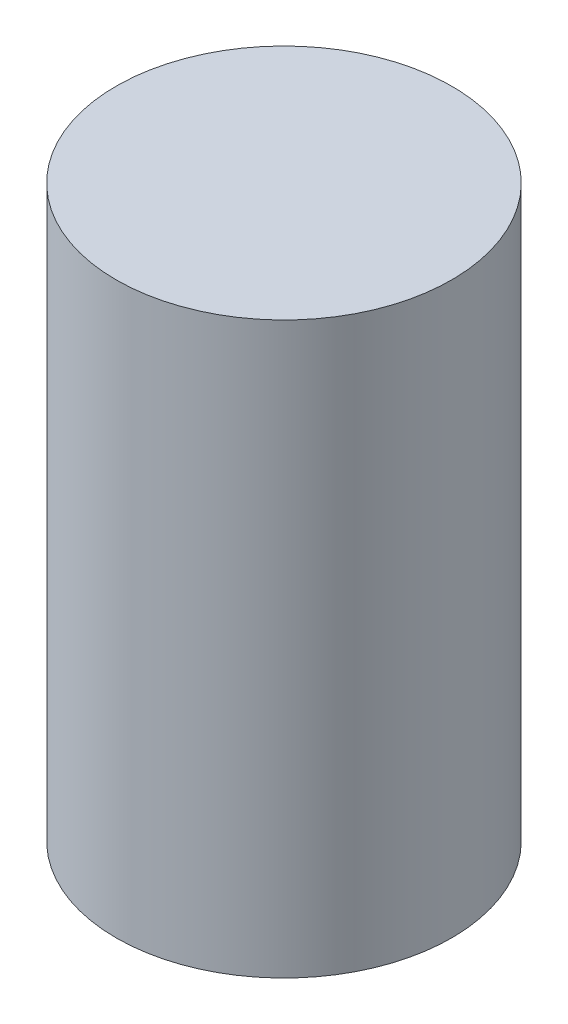
ISO-10303-21;
HEADER;
FILE_DESCRIPTION(('STEP AP214'),'2;1');
FILE_NAME('part.step','',(''),(''),'','','');
FILE_SCHEMA(('AUTOMOTIVE_DESIGN { 1 0 10303 214 1 1 1 1 }'));
ENDSEC;
DATA;
#1=APPLICATION_CONTEXT('core data for automotive mechanical design processes');
#2=APPLICATION_PROTOCOL_DEFINITION('international standard','automotive_design',2000,#1);
#3=PRODUCT_CONTEXT('',#1,'mechanical');
#4=PRODUCT('Part','Part','',(#3));
#5=PRODUCT_RELATED_PRODUCT_CATEGORY('part','',(#4));
#6=PRODUCT_DEFINITION_FORMATION('','',#4);
#7=PRODUCT_DEFINITION_CONTEXT('part definition',#1,'design');
#8=PRODUCT_DEFINITION('design','',#6,#7);
#9=PRODUCT_DEFINITION_SHAPE('','',#8);
#10=(LENGTH_UNIT() NAMED_UNIT(*) SI_UNIT(.MILLI.,.METRE.));
#11=(NAMED_UNIT(*) PLANE_ANGLE_UNIT() SI_UNIT($,.RADIAN.));
#12=(NAMED_UNIT(*) SI_UNIT($,.STERADIAN.) SOLID_ANGLE_UNIT());
#13=UNCERTAINTY_MEASURE_WITH_UNIT(LENGTH_MEASURE(1.E-05),#10,'distance_accuracy_value','');
#14=(GEOMETRIC_REPRESENTATION_CONTEXT(3) GLOBAL_UNCERTAINTY_ASSIGNED_CONTEXT((#13)) GLOBAL_UNIT_ASSIGNED_CONTEXT((#10,
#11,#12)) REPRESENTATION_CONTEXT('',''));
#15=CARTESIAN_POINT('',(0.,0.,0.));
#16=DIRECTION('',(0.,0.,1.));
#17=DIRECTION('',(1.,0.,0.));
#18=AXIS2_PLACEMENT_3D('',#15,#16,#17);
#19=CARTESIAN_POINT('',(0.,250.,0.));
#20=DIRECTION('',(0.,-1.,0.));
#21=DIRECTION('',(0.,0.,-1.));
#22=AXIS2_PLACEMENT_3D('',#19,#20,#21);
#23=CYLINDRICAL_SURFACE('',#22,73.61);
#24=CARTESIAN_POINT('',(0.,250.,0.));
#25=DIRECTION('',(0.,1.,0.));
#26=DIRECTION('',(0.,0.,1.));
#27=AXIS2_PLACEMENT_3D('',#24,#25,#26);
#28=CIRCLE('',#27,73.61);
#29=CARTESIAN_POINT('',(0.,250.,73.61));
#30=VERTEX_POINT('',#29);
#31=EDGE_CURVE('E10',#30,#30,#28,.T.);
#32=ORIENTED_EDGE('',*,*,#31,.F.);
#33=EDGE_LOOP('',(#32));
#34=FACE_BOUND('',#33,.T.);
#35=CARTESIAN_POINT('',(0.,0.,0.));
#36=DIRECTION('',(0.,1.,0.));
#37=DIRECTION('',(0.,0.,1.));
#38=AXIS2_PLACEMENT_3D('',#35,#36,#37);
#39=CIRCLE('',#38,73.61);
#40=CARTESIAN_POINT('',(0.,0.,73.61));
#41=VERTEX_POINT('',#40);
#42=EDGE_CURVE('E36',#41,#41,#39,.T.);
#43=ORIENTED_EDGE('',*,*,#42,.T.);
#44=EDGE_LOOP('',(#43));
#45=FACE_BOUND('',#44,.T.);
#46=ADVANCED_FACE('F33',(#34,#45),#23,.T.);
#47=CARTESIAN_POINT('',(0.,250.,0.));
#48=DIRECTION('',(0.,1.,0.));
#49=DIRECTION('',(0.,0.,1.));
#50=AXIS2_PLACEMENT_3D('',#47,#48,#49);
#51=PLANE('',#50);
#52=ORIENTED_EDGE('',*,*,#31,.T.);
#53=EDGE_LOOP('',(#52));
#54=FACE_BOUND('',#53,.T.);
#55=ADVANCED_FACE('F48',(#54),#51,.T.);
#56=CARTESIAN_POINT('',(0.,0.,0.));
#57=DIRECTION('',(0.,1.,0.));
#58=DIRECTION('',(0.,0.,1.));
#59=AXIS2_PLACEMENT_3D('',#56,#57,#58);
#60=PLANE('',#59);
#61=ORIENTED_EDGE('',*,*,#42,.F.);
#62=EDGE_LOOP('',(#61));
#63=FACE_BOUND('',#62,.T.);
#64=ADVANCED_FACE('F46',(#63),#60,.F.);
#65=CLOSED_SHELL('',(#46,#55,#64));
#66=MANIFOLD_SOLID_BREP('B2',#65);
#67=ADVANCED_BREP_SHAPE_REPRESENTATION('',(#18,#66),#14);
#68=SHAPE_DEFINITION_REPRESENTATION(#9,#67);
ENDSEC;
END-ISO-10303-21;
